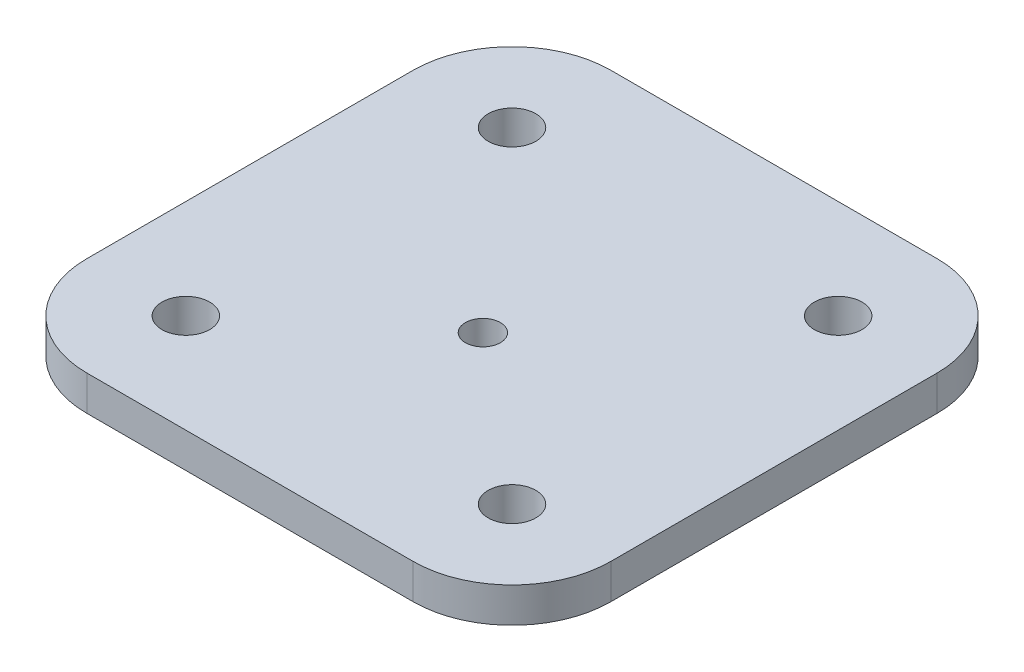
ISO-10303-21;
HEADER;
FILE_DESCRIPTION(('STEP AP214'),'2;1');
FILE_NAME('part.step','',(''),(''),'','','');
FILE_SCHEMA(('AUTOMOTIVE_DESIGN { 1 0 10303 214 1 1 1 1 }'));
ENDSEC;
DATA;
#1=APPLICATION_CONTEXT('core data for automotive mechanical design processes');
#2=APPLICATION_PROTOCOL_DEFINITION('international standard','automotive_design',2000,#1);
#3=PRODUCT_CONTEXT('',#1,'mechanical');
#4=PRODUCT('Part','Part','',(#3));
#5=PRODUCT_RELATED_PRODUCT_CATEGORY('part','',(#4));
#6=PRODUCT_DEFINITION_FORMATION('','',#4);
#7=PRODUCT_DEFINITION_CONTEXT('part definition',#1,'design');
#8=PRODUCT_DEFINITION('design','',#6,#7);
#9=PRODUCT_DEFINITION_SHAPE('','',#8);
#10=(LENGTH_UNIT() NAMED_UNIT(*) SI_UNIT(.MILLI.,.METRE.));
#11=(NAMED_UNIT(*) PLANE_ANGLE_UNIT() SI_UNIT($,.RADIAN.));
#12=(NAMED_UNIT(*) SI_UNIT($,.STERADIAN.) SOLID_ANGLE_UNIT());
#13=UNCERTAINTY_MEASURE_WITH_UNIT(LENGTH_MEASURE(1.E-05),#10,'distance_accuracy_value','');
#14=(GEOMETRIC_REPRESENTATION_CONTEXT(3) GLOBAL_UNCERTAINTY_ASSIGNED_CONTEXT((#13)) GLOBAL_UNIT_ASSIGNED_CONTEXT((#10,
#11,#12)) REPRESENTATION_CONTEXT('',''));
#15=CARTESIAN_POINT('',(0.,0.,0.));
#16=DIRECTION('',(0.,0.,1.));
#17=DIRECTION('',(1.,0.,0.));
#18=AXIS2_PLACEMENT_3D('',#15,#16,#17);
#19=CARTESIAN_POINT('',(-14.,3.,14.));
#20=DIRECTION('',(0.,1.,0.));
#21=DIRECTION('',(0.,0.,1.));
#22=AXIS2_PLACEMENT_3D('',#19,#20,#21);
#23=PLANE('',#22);
#24=CARTESIAN_POINT('',(0.,3.,2.50000000000001));
#25=DIRECTION('',(0.,-1.,0.));
#26=DIRECTION('',(0.,0.,-1.));
#27=AXIS2_PLACEMENT_3D('',#24,#25,#26);
#28=CIRCLE('',#27,1.5);
#29=CARTESIAN_POINT('',(0.,3.,1.00000000000001));
#30=VERTEX_POINT('',#29);
#31=EDGE_CURVE('E202',#30,#30,#28,.T.);
#32=ORIENTED_EDGE('',*,*,#31,.T.);
#33=EDGE_LOOP('',(#32));
#34=FACE_BOUND('',#33,.T.);
#35=CARTESIAN_POINT('',(-14.,3.,14.));
#36=DIRECTION('',(0.,1.,0.));
#37=DIRECTION('',(0.,0.,1.));
#38=AXIS2_PLACEMENT_3D('',#35,#36,#37);
#39=CIRCLE('',#38,2.05);
#40=CARTESIAN_POINT('',(-14.,3.,16.05));
#41=VERTEX_POINT('',#40);
#42=EDGE_CURVE('E190',#41,#41,#39,.T.);
#43=ORIENTED_EDGE('',*,*,#42,.F.);
#44=EDGE_LOOP('',(#43));
#45=FACE_BOUND('',#44,.T.);
#46=CARTESIAN_POINT('',(14.,3.,-14.));
#47=DIRECTION('',(0.,1.,0.));
#48=DIRECTION('',(0.,0.,1.));
#49=AXIS2_PLACEMENT_3D('',#46,#47,#48);
#50=CIRCLE('',#49,2.05);
#51=CARTESIAN_POINT('',(14.,3.,-11.95));
#52=VERTEX_POINT('',#51);
#53=EDGE_CURVE('E136',#52,#52,#50,.T.);
#54=ORIENTED_EDGE('',*,*,#53,.F.);
#55=EDGE_LOOP('',(#54));
#56=FACE_BOUND('',#55,.T.);
#57=CARTESIAN_POINT('',(-14.,3.,14.));
#58=DIRECTION('',(0.,1.,0.));
#59=DIRECTION('',(0.,0.,1.));
#60=AXIS2_PLACEMENT_3D('',#57,#58,#59);
#61=CIRCLE('',#60,8.5);
#62=CARTESIAN_POINT('',(-22.5,3.,13.9999999999999));
#63=VERTEX_POINT('',#62);
#64=CARTESIAN_POINT('',(-14.,3.,22.5));
#65=VERTEX_POINT('',#64);
#66=EDGE_CURVE('E147',#63,#65,#61,.T.);
#67=ORIENTED_EDGE('',*,*,#66,.T.);
#68=DIRECTION('',(1.,0.,0.));
#69=VECTOR('',#68,1.);
#70=CARTESIAN_POINT('',(-14.,3.,22.5));
#71=LINE('',#70,#69);
#72=CARTESIAN_POINT('',(13.9999999999999,3.,22.5));
#73=VERTEX_POINT('',#72);
#74=EDGE_CURVE('E95',#65,#73,#71,.T.);
#75=ORIENTED_EDGE('',*,*,#74,.T.);
#76=CARTESIAN_POINT('',(14.,3.,14.));
#77=DIRECTION('',(0.,1.,0.));
#78=DIRECTION('',(0.,0.,1.));
#79=AXIS2_PLACEMENT_3D('',#76,#77,#78);
#80=CIRCLE('',#79,8.5);
#81=CARTESIAN_POINT('',(22.5,3.,13.9999999999999));
#82=VERTEX_POINT('',#81);
#83=EDGE_CURVE('E162',#73,#82,#80,.T.);
#84=ORIENTED_EDGE('',*,*,#83,.T.);
#85=DIRECTION('',(0.,0.,-1.));
#86=VECTOR('',#85,1.);
#87=CARTESIAN_POINT('',(22.5,3.,13.9999999999999));
#88=LINE('',#87,#86);
#89=CARTESIAN_POINT('',(22.5,3.,-13.9999999999999));
#90=VERTEX_POINT('',#89);
#91=EDGE_CURVE('E175',#82,#90,#88,.T.);
#92=ORIENTED_EDGE('',*,*,#91,.T.);
#93=CARTESIAN_POINT('',(14.,3.,-14.));
#94=DIRECTION('',(0.,1.,0.));
#95=DIRECTION('',(0.,0.,1.));
#96=AXIS2_PLACEMENT_3D('',#93,#94,#95);
#97=CIRCLE('',#96,8.5);
#98=CARTESIAN_POINT('',(13.9999999999999,3.,-22.5));
#99=VERTEX_POINT('',#98);
#100=EDGE_CURVE('E114',#90,#99,#97,.T.);
#101=ORIENTED_EDGE('',*,*,#100,.T.);
#102=DIRECTION('',(-1.,0.,0.));
#103=VECTOR('',#102,1.);
#104=CARTESIAN_POINT('',(-13.9999999999999,3.,-22.5));
#105=LINE('',#104,#103);
#106=CARTESIAN_POINT('',(-13.9999999999999,3.,-22.5));
#107=VERTEX_POINT('',#106);
#108=EDGE_CURVE('E108',#99,#107,#105,.T.);
#109=ORIENTED_EDGE('',*,*,#108,.T.);
#110=CARTESIAN_POINT('',(-14.,3.,-14.));
#111=DIRECTION('',(0.,1.,0.));
#112=DIRECTION('',(0.,0.,1.));
#113=AXIS2_PLACEMENT_3D('',#110,#111,#112);
#114=CIRCLE('',#113,8.5);
#115=CARTESIAN_POINT('',(-22.5,3.,-13.9999999999999));
#116=VERTEX_POINT('',#115);
#117=EDGE_CURVE('E112',#107,#116,#114,.T.);
#118=ORIENTED_EDGE('',*,*,#117,.T.);
#119=DIRECTION('',(0.,0.,1.));
#120=VECTOR('',#119,1.);
#121=CARTESIAN_POINT('',(-22.5,3.,13.9999999999999));
#122=LINE('',#121,#120);
#123=EDGE_CURVE('E52',#116,#63,#122,.T.);
#124=ORIENTED_EDGE('',*,*,#123,.T.);
#125=EDGE_LOOP('',(#67,#75,#84,#92,#101,#109,#118,#124));
#126=FACE_BOUND('',#125,.T.);
#127=CARTESIAN_POINT('',(14.,3.,14.));
#128=DIRECTION('',(0.,1.,0.));
#129=DIRECTION('',(0.,0.,1.));
#130=AXIS2_PLACEMENT_3D('',#127,#128,#129);
#131=CIRCLE('',#130,2.05);
#132=CARTESIAN_POINT('',(14.,3.,16.05));
#133=VERTEX_POINT('',#132);
#134=EDGE_CURVE('E184',#133,#133,#131,.T.);
#135=ORIENTED_EDGE('',*,*,#134,.F.);
#136=EDGE_LOOP('',(#135));
#137=FACE_BOUND('',#136,.T.);
#138=CARTESIAN_POINT('',(-14.,3.,-14.));
#139=DIRECTION('',(0.,1.,0.));
#140=DIRECTION('',(0.,0.,1.));
#141=AXIS2_PLACEMENT_3D('',#138,#139,#140);
#142=CIRCLE('',#141,2.05);
#143=CARTESIAN_POINT('',(-14.,3.,-11.95));
#144=VERTEX_POINT('',#143);
#145=EDGE_CURVE('E196',#144,#144,#142,.T.);
#146=ORIENTED_EDGE('',*,*,#145,.F.);
#147=EDGE_LOOP('',(#146));
#148=FACE_BOUND('',#147,.T.);
#149=ADVANCED_FACE('F35',(#34,#45,#56,#126,#137,#148),#23,.T.);
#150=CARTESIAN_POINT('',(-14.,0.,14.));
#151=DIRECTION('',(0.,1.,0.));
#152=DIRECTION('',(0.,0.,1.));
#153=AXIS2_PLACEMENT_3D('',#150,#151,#152);
#154=PLANE('',#153);
#155=CARTESIAN_POINT('',(0.,0.,2.50000000000001));
#156=DIRECTION('',(0.,-1.,0.));
#157=DIRECTION('',(0.,0.,-1.));
#158=AXIS2_PLACEMENT_3D('',#155,#156,#157);
#159=CIRCLE('',#158,1.5);
#160=CARTESIAN_POINT('',(0.,0.,1.00000000000001));
#161=VERTEX_POINT('',#160);
#162=EDGE_CURVE('E205',#161,#161,#159,.T.);
#163=ORIENTED_EDGE('',*,*,#162,.F.);
#164=EDGE_LOOP('',(#163));
#165=FACE_BOUND('',#164,.T.);
#166=CARTESIAN_POINT('',(-14.,0.,14.));
#167=DIRECTION('',(0.,1.,0.));
#168=DIRECTION('',(0.,0.,1.));
#169=AXIS2_PLACEMENT_3D('',#166,#167,#168);
#170=CIRCLE('',#169,8.5);
#171=CARTESIAN_POINT('',(-22.5,0.,13.9999999999999));
#172=VERTEX_POINT('',#171);
#173=CARTESIAN_POINT('',(-14.,0.,22.5));
#174=VERTEX_POINT('',#173);
#175=EDGE_CURVE('E132',#172,#174,#170,.T.);
#176=ORIENTED_EDGE('',*,*,#175,.F.);
#177=DIRECTION('',(0.,0.,1.));
#178=VECTOR('',#177,1.);
#179=CARTESIAN_POINT('',(-22.5,0.,13.9999999999999));
#180=LINE('',#179,#178);
#181=CARTESIAN_POINT('',(-22.5,0.,-13.9999999999999));
#182=VERTEX_POINT('',#181);
#183=EDGE_CURVE('E87',#182,#172,#180,.T.);
#184=ORIENTED_EDGE('',*,*,#183,.F.);
#185=CARTESIAN_POINT('',(-14.,0.,-14.));
#186=DIRECTION('',(0.,1.,0.));
#187=DIRECTION('',(0.,0.,1.));
#188=AXIS2_PLACEMENT_3D('',#185,#186,#187);
#189=CIRCLE('',#188,8.5);
#190=CARTESIAN_POINT('',(-13.9999999999999,0.,-22.5));
#191=VERTEX_POINT('',#190);
#192=EDGE_CURVE('E81',#191,#182,#189,.T.);
#193=ORIENTED_EDGE('',*,*,#192,.F.);
#194=DIRECTION('',(-1.,0.,0.));
#195=VECTOR('',#194,1.);
#196=CARTESIAN_POINT('',(-13.9999999999999,0.,-22.5));
#197=LINE('',#196,#195);
#198=CARTESIAN_POINT('',(13.9999999999999,0.,-22.5));
#199=VERTEX_POINT('',#198);
#200=EDGE_CURVE('E122',#199,#191,#197,.T.);
#201=ORIENTED_EDGE('',*,*,#200,.F.);
#202=CARTESIAN_POINT('',(14.,0.,-14.));
#203=DIRECTION('',(0.,1.,0.));
#204=DIRECTION('',(0.,0.,1.));
#205=AXIS2_PLACEMENT_3D('',#202,#203,#204);
#206=CIRCLE('',#205,8.5);
#207=CARTESIAN_POINT('',(22.5,0.,-13.9999999999999));
#208=VERTEX_POINT('',#207);
#209=EDGE_CURVE('E142',#208,#199,#206,.T.);
#210=ORIENTED_EDGE('',*,*,#209,.F.);
#211=DIRECTION('',(0.,0.,-1.));
#212=VECTOR('',#211,1.);
#213=CARTESIAN_POINT('',(22.5,0.,13.9999999999999));
#214=LINE('',#213,#212);
#215=CARTESIAN_POINT('',(22.5,0.,13.9999999999999));
#216=VERTEX_POINT('',#215);
#217=EDGE_CURVE('E140',#216,#208,#214,.T.);
#218=ORIENTED_EDGE('',*,*,#217,.F.);
#219=CARTESIAN_POINT('',(14.,0.,14.));
#220=DIRECTION('',(0.,1.,0.));
#221=DIRECTION('',(0.,0.,1.));
#222=AXIS2_PLACEMENT_3D('',#219,#220,#221);
#223=CIRCLE('',#222,8.5);
#224=CARTESIAN_POINT('',(13.9999999999999,0.,22.5));
#225=VERTEX_POINT('',#224);
#226=EDGE_CURVE('E138',#225,#216,#223,.T.);
#227=ORIENTED_EDGE('',*,*,#226,.F.);
#228=DIRECTION('',(1.,0.,0.));
#229=VECTOR('',#228,1.);
#230=CARTESIAN_POINT('',(-14.,0.,22.5));
#231=LINE('',#230,#229);
#232=EDGE_CURVE('E135',#174,#225,#231,.T.);
#233=ORIENTED_EDGE('',*,*,#232,.F.);
#234=EDGE_LOOP('',(#176,#184,#193,#201,#210,#218,#227,#233));
#235=FACE_BOUND('',#234,.T.);
#236=CARTESIAN_POINT('',(14.,0.,-14.));
#237=DIRECTION('',(0.,1.,0.));
#238=DIRECTION('',(0.,0.,1.));
#239=AXIS2_PLACEMENT_3D('',#236,#237,#238);
#240=CIRCLE('',#239,2.05);
#241=CARTESIAN_POINT('',(14.,0.,-11.95));
#242=VERTEX_POINT('',#241);
#243=EDGE_CURVE('E181',#242,#242,#240,.T.);
#244=ORIENTED_EDGE('',*,*,#243,.T.);
#245=EDGE_LOOP('',(#244));
#246=FACE_BOUND('',#245,.T.);
#247=CARTESIAN_POINT('',(14.,0.,14.));
#248=DIRECTION('',(0.,1.,0.));
#249=DIRECTION('',(0.,0.,1.));
#250=AXIS2_PLACEMENT_3D('',#247,#248,#249);
#251=CIRCLE('',#250,2.05);
#252=CARTESIAN_POINT('',(14.,0.,16.05));
#253=VERTEX_POINT('',#252);
#254=EDGE_CURVE('E187',#253,#253,#251,.T.);
#255=ORIENTED_EDGE('',*,*,#254,.T.);
#256=EDGE_LOOP('',(#255));
#257=FACE_BOUND('',#256,.T.);
#258=CARTESIAN_POINT('',(-14.,0.,14.));
#259=DIRECTION('',(0.,1.,0.));
#260=DIRECTION('',(0.,0.,1.));
#261=AXIS2_PLACEMENT_3D('',#258,#259,#260);
#262=CIRCLE('',#261,2.05);
#263=CARTESIAN_POINT('',(-14.,0.,16.05));
#264=VERTEX_POINT('',#263);
#265=EDGE_CURVE('E193',#264,#264,#262,.T.);
#266=ORIENTED_EDGE('',*,*,#265,.T.);
#267=EDGE_LOOP('',(#266));
#268=FACE_BOUND('',#267,.T.);
#269=CARTESIAN_POINT('',(-14.,0.,-14.));
#270=DIRECTION('',(0.,1.,0.));
#271=DIRECTION('',(0.,0.,1.));
#272=AXIS2_PLACEMENT_3D('',#269,#270,#271);
#273=CIRCLE('',#272,2.05);
#274=CARTESIAN_POINT('',(-14.,0.,-11.95));
#275=VERTEX_POINT('',#274);
#276=EDGE_CURVE('E199',#275,#275,#273,.T.);
#277=ORIENTED_EDGE('',*,*,#276,.T.);
#278=EDGE_LOOP('',(#277));
#279=FACE_BOUND('',#278,.T.);
#280=ADVANCED_FACE('F166',(#165,#235,#246,#257,#268,#279),#154,.F.);
#281=CARTESIAN_POINT('',(-14.,3.,14.));
#282=DIRECTION('',(0.,-1.,0.));
#283=DIRECTION('',(0.,0.,-1.));
#284=AXIS2_PLACEMENT_3D('',#281,#282,#283);
#285=CYLINDRICAL_SURFACE('',#284,8.5);
#286=ORIENTED_EDGE('',*,*,#175,.T.);
#287=DIRECTION('',(0.,-1.,0.));
#288=VECTOR('',#287,1.);
#289=CARTESIAN_POINT('',(-14.,3.,22.5));
#290=LINE('',#289,#288);
#291=EDGE_CURVE('E11',#65,#174,#290,.T.);
#292=ORIENTED_EDGE('',*,*,#291,.F.);
#293=ORIENTED_EDGE('',*,*,#66,.F.);
#294=DIRECTION('',(0.,-1.,0.));
#295=VECTOR('',#294,1.);
#296=CARTESIAN_POINT('',(-22.5,3.,13.9999999999999));
#297=LINE('',#296,#295);
#298=EDGE_CURVE('E128',#63,#172,#297,.T.);
#299=ORIENTED_EDGE('',*,*,#298,.T.);
#300=EDGE_LOOP('',(#286,#292,#293,#299));
#301=FACE_BOUND('',#300,.T.);
#302=ADVANCED_FACE('F37',(#301),#285,.T.);
#303=CARTESIAN_POINT('',(-14.,3.,22.5));
#304=DIRECTION('',(0.,0.,-1.));
#305=DIRECTION('',(-1.,0.,0.));
#306=AXIS2_PLACEMENT_3D('',#303,#304,#305);
#307=PLANE('',#306);
#308=ORIENTED_EDGE('',*,*,#232,.T.);
#309=DIRECTION('',(0.,-1.,0.));
#310=VECTOR('',#309,1.);
#311=CARTESIAN_POINT('',(13.9999999999999,3.,22.5));
#312=LINE('',#311,#310);
#313=EDGE_CURVE('E44',#73,#225,#312,.T.);
#314=ORIENTED_EDGE('',*,*,#313,.F.);
#315=ORIENTED_EDGE('',*,*,#74,.F.);
#316=ORIENTED_EDGE('',*,*,#291,.T.);
#317=EDGE_LOOP('',(#308,#314,#315,#316));
#318=FACE_BOUND('',#317,.T.);
#319=ADVANCED_FACE('F226',(#318),#307,.F.);
#320=CARTESIAN_POINT('',(14.,3.,14.));
#321=DIRECTION('',(0.,-1.,0.));
#322=DIRECTION('',(0.,0.,-1.));
#323=AXIS2_PLACEMENT_3D('',#320,#321,#322);
#324=CYLINDRICAL_SURFACE('',#323,8.5);
#325=ORIENTED_EDGE('',*,*,#226,.T.);
#326=DIRECTION('',(0.,-1.,0.));
#327=VECTOR('',#326,1.);
#328=CARTESIAN_POINT('',(22.5,3.,13.9999999999999));
#329=LINE('',#328,#327);
#330=EDGE_CURVE('E154',#82,#216,#329,.T.);
#331=ORIENTED_EDGE('',*,*,#330,.F.);
#332=ORIENTED_EDGE('',*,*,#83,.F.);
#333=ORIENTED_EDGE('',*,*,#313,.T.);
#334=EDGE_LOOP('',(#325,#331,#332,#333));
#335=FACE_BOUND('',#334,.T.);
#336=ADVANCED_FACE('F160',(#335),#324,.T.);
#337=CARTESIAN_POINT('',(22.5,3.,13.9999999999999));
#338=DIRECTION('',(-1.,0.,0.));
#339=DIRECTION('',(0.,0.,1.));
#340=AXIS2_PLACEMENT_3D('',#337,#338,#339);
#341=PLANE('',#340);
#342=ORIENTED_EDGE('',*,*,#217,.T.);
#343=DIRECTION('',(0.,-1.,0.));
#344=VECTOR('',#343,1.);
#345=CARTESIAN_POINT('',(22.5,3.,-13.9999999999999));
#346=LINE('',#345,#344);
#347=EDGE_CURVE('E151',#90,#208,#346,.T.);
#348=ORIENTED_EDGE('',*,*,#347,.F.);
#349=ORIENTED_EDGE('',*,*,#91,.F.);
#350=ORIENTED_EDGE('',*,*,#330,.T.);
#351=EDGE_LOOP('',(#342,#348,#349,#350));
#352=FACE_BOUND('',#351,.T.);
#353=ADVANCED_FACE('F171',(#352),#341,.F.);
#354=CARTESIAN_POINT('',(14.,3.,-14.));
#355=DIRECTION('',(0.,-1.,0.));
#356=DIRECTION('',(0.,0.,-1.));
#357=AXIS2_PLACEMENT_3D('',#354,#355,#356);
#358=CYLINDRICAL_SURFACE('',#357,8.5);
#359=ORIENTED_EDGE('',*,*,#209,.T.);
#360=DIRECTION('',(0.,-1.,0.));
#361=VECTOR('',#360,1.);
#362=CARTESIAN_POINT('',(13.9999999999999,3.,-22.5));
#363=LINE('',#362,#361);
#364=EDGE_CURVE('E123',#99,#199,#363,.T.);
#365=ORIENTED_EDGE('',*,*,#364,.F.);
#366=ORIENTED_EDGE('',*,*,#100,.F.);
#367=ORIENTED_EDGE('',*,*,#347,.T.);
#368=EDGE_LOOP('',(#359,#365,#366,#367));
#369=FACE_BOUND('',#368,.T.);
#370=ADVANCED_FACE('F174',(#369),#358,.T.);
#371=CARTESIAN_POINT('',(-13.9999999999999,3.,-22.5));
#372=DIRECTION('',(0.,0.,1.));
#373=DIRECTION('',(1.,0.,0.));
#374=AXIS2_PLACEMENT_3D('',#371,#372,#373);
#375=PLANE('',#374);
#376=ORIENTED_EDGE('',*,*,#200,.T.);
#377=DIRECTION('',(0.,-1.,0.));
#378=VECTOR('',#377,1.);
#379=CARTESIAN_POINT('',(-13.9999999999999,3.,-22.5));
#380=LINE('',#379,#378);
#381=EDGE_CURVE('E119',#107,#191,#380,.T.);
#382=ORIENTED_EDGE('',*,*,#381,.F.);
#383=ORIENTED_EDGE('',*,*,#108,.F.);
#384=ORIENTED_EDGE('',*,*,#364,.T.);
#385=EDGE_LOOP('',(#376,#382,#383,#384));
#386=FACE_BOUND('',#385,.T.);
#387=ADVANCED_FACE('F120',(#386),#375,.F.);
#388=CARTESIAN_POINT('',(-14.,3.,-14.));
#389=DIRECTION('',(0.,-1.,0.));
#390=DIRECTION('',(0.,0.,-1.));
#391=AXIS2_PLACEMENT_3D('',#388,#389,#390);
#392=CYLINDRICAL_SURFACE('',#391,8.5);
#393=ORIENTED_EDGE('',*,*,#192,.T.);
#394=DIRECTION('',(0.,-1.,0.));
#395=VECTOR('',#394,1.);
#396=CARTESIAN_POINT('',(-22.5,3.,-13.9999999999999));
#397=LINE('',#396,#395);
#398=EDGE_CURVE('E124',#116,#182,#397,.T.);
#399=ORIENTED_EDGE('',*,*,#398,.F.);
#400=ORIENTED_EDGE('',*,*,#117,.F.);
#401=ORIENTED_EDGE('',*,*,#381,.T.);
#402=EDGE_LOOP('',(#393,#399,#400,#401));
#403=FACE_BOUND('',#402,.T.);
#404=ADVANCED_FACE('F126',(#403),#392,.T.);
#405=CARTESIAN_POINT('',(-22.5,3.,13.9999999999999));
#406=DIRECTION('',(1.,0.,0.));
#407=DIRECTION('',(0.,0.,-1.));
#408=AXIS2_PLACEMENT_3D('',#405,#406,#407);
#409=PLANE('',#408);
#410=ORIENTED_EDGE('',*,*,#183,.T.);
#411=ORIENTED_EDGE('',*,*,#298,.F.);
#412=ORIENTED_EDGE('',*,*,#123,.F.);
#413=ORIENTED_EDGE('',*,*,#398,.T.);
#414=EDGE_LOOP('',(#410,#411,#412,#413));
#415=FACE_BOUND('',#414,.T.);
#416=ADVANCED_FACE('F231',(#415),#409,.F.);
#417=CARTESIAN_POINT('',(14.,3.,-14.));
#418=DIRECTION('',(0.,-1.,0.));
#419=DIRECTION('',(0.,0.,-1.));
#420=AXIS2_PLACEMENT_3D('',#417,#418,#419);
#421=CYLINDRICAL_SURFACE('',#420,2.05);
#422=ORIENTED_EDGE('',*,*,#53,.T.);
#423=EDGE_LOOP('',(#422));
#424=FACE_BOUND('',#423,.T.);
#425=ORIENTED_EDGE('',*,*,#243,.F.);
#426=EDGE_LOOP('',(#425));
#427=FACE_BOUND('',#426,.T.);
#428=ADVANCED_FACE('F234',(#424,#427),#421,.F.);
#429=CARTESIAN_POINT('',(14.,3.,14.));
#430=DIRECTION('',(0.,-1.,0.));
#431=DIRECTION('',(0.,0.,-1.));
#432=AXIS2_PLACEMENT_3D('',#429,#430,#431);
#433=CYLINDRICAL_SURFACE('',#432,2.05);
#434=ORIENTED_EDGE('',*,*,#134,.T.);
#435=EDGE_LOOP('',(#434));
#436=FACE_BOUND('',#435,.T.);
#437=ORIENTED_EDGE('',*,*,#254,.F.);
#438=EDGE_LOOP('',(#437));
#439=FACE_BOUND('',#438,.T.);
#440=ADVANCED_FACE('F281',(#436,#439),#433,.F.);
#441=CARTESIAN_POINT('',(-14.,3.,14.));
#442=DIRECTION('',(0.,-1.,0.));
#443=DIRECTION('',(0.,0.,-1.));
#444=AXIS2_PLACEMENT_3D('',#441,#442,#443);
#445=CYLINDRICAL_SURFACE('',#444,2.05);
#446=ORIENTED_EDGE('',*,*,#42,.T.);
#447=EDGE_LOOP('',(#446));
#448=FACE_BOUND('',#447,.T.);
#449=ORIENTED_EDGE('',*,*,#265,.F.);
#450=EDGE_LOOP('',(#449));
#451=FACE_BOUND('',#450,.T.);
#452=ADVANCED_FACE('F288',(#448,#451),#445,.F.);
#453=CARTESIAN_POINT('',(-14.,3.,-14.));
#454=DIRECTION('',(0.,-1.,0.));
#455=DIRECTION('',(0.,0.,-1.));
#456=AXIS2_PLACEMENT_3D('',#453,#454,#455);
#457=CYLINDRICAL_SURFACE('',#456,2.05);
#458=ORIENTED_EDGE('',*,*,#145,.T.);
#459=EDGE_LOOP('',(#458));
#460=FACE_BOUND('',#459,.T.);
#461=ORIENTED_EDGE('',*,*,#276,.F.);
#462=EDGE_LOOP('',(#461));
#463=FACE_BOUND('',#462,.T.);
#464=ADVANCED_FACE('F216',(#460,#463),#457,.F.);
#465=CARTESIAN_POINT('',(0.,3.,2.50000000000001));
#466=DIRECTION('',(0.,-1.,0.));
#467=DIRECTION('',(0.,0.,-1.));
#468=AXIS2_PLACEMENT_3D('',#465,#466,#467);
#469=CYLINDRICAL_SURFACE('',#468,1.5);
#470=ORIENTED_EDGE('',*,*,#31,.F.);
#471=EDGE_LOOP('',(#470));
#472=FACE_BOUND('',#471,.T.);
#473=ORIENTED_EDGE('',*,*,#162,.T.);
#474=EDGE_LOOP('',(#473));
#475=FACE_BOUND('',#474,.T.);
#476=ADVANCED_FACE('F213',(#472,#475),#469,.F.);
#477=CLOSED_SHELL('',(#149,#280,#302,#319,#336,#353,#370,#387,#404,#416,#428,#440,#452,#464,#476));
#478=MANIFOLD_SOLID_BREP('B2',#477);
#479=ADVANCED_BREP_SHAPE_REPRESENTATION('',(#18,#478),#14);
#480=SHAPE_DEFINITION_REPRESENTATION(#9,#479);
ENDSEC;
END-ISO-10303-21;
